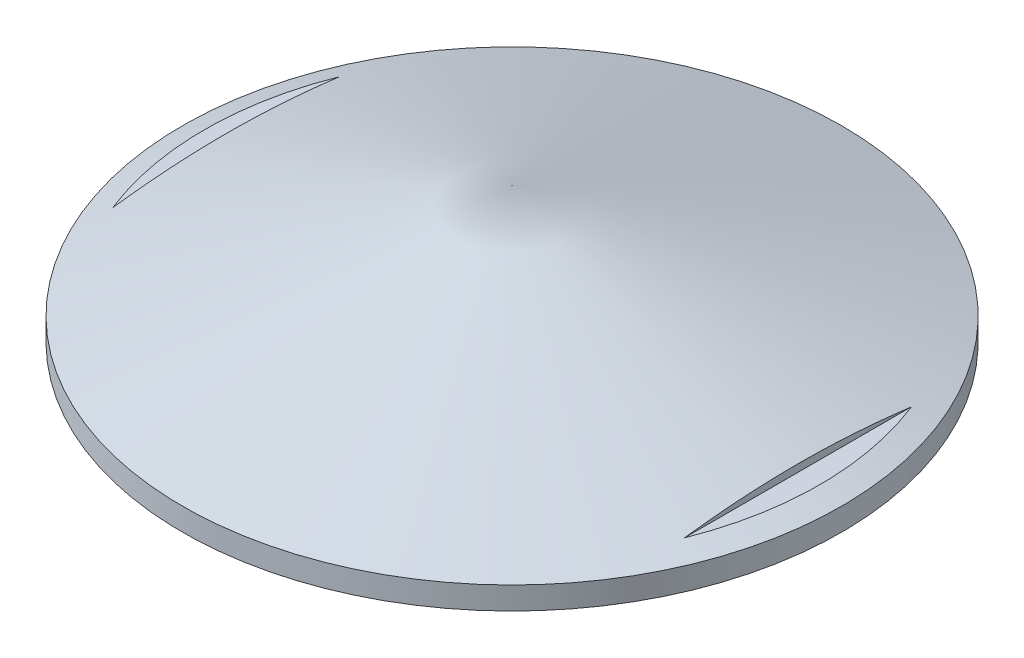
ISO-10303-21;
HEADER;
FILE_DESCRIPTION(('STEP AP214'),'2;1');
FILE_NAME('part.step','',(''),(''),'','','');
FILE_SCHEMA(('AUTOMOTIVE_DESIGN { 1 0 10303 214 1 1 1 1 }'));
ENDSEC;
DATA;
#1=APPLICATION_CONTEXT('core data for automotive mechanical design processes');
#2=APPLICATION_PROTOCOL_DEFINITION('international standard','automotive_design',2000,#1);
#3=PRODUCT_CONTEXT('',#1,'mechanical');
#4=PRODUCT('Part','Part','',(#3));
#5=PRODUCT_RELATED_PRODUCT_CATEGORY('part','',(#4));
#6=PRODUCT_DEFINITION_FORMATION('','',#4);
#7=PRODUCT_DEFINITION_CONTEXT('part definition',#1,'design');
#8=PRODUCT_DEFINITION('design','',#6,#7);
#9=PRODUCT_DEFINITION_SHAPE('','',#8);
#10=(LENGTH_UNIT() NAMED_UNIT(*) SI_UNIT(.MILLI.,.METRE.));
#11=(NAMED_UNIT(*) PLANE_ANGLE_UNIT() SI_UNIT($,.RADIAN.));
#12=(NAMED_UNIT(*) SI_UNIT($,.STERADIAN.) SOLID_ANGLE_UNIT());
#13=UNCERTAINTY_MEASURE_WITH_UNIT(LENGTH_MEASURE(1.E-05),#10,'distance_accuracy_value','');
#14=(GEOMETRIC_REPRESENTATION_CONTEXT(3) GLOBAL_UNCERTAINTY_ASSIGNED_CONTEXT((#13)) GLOBAL_UNIT_ASSIGNED_CONTEXT((#10,
#11,#12)) REPRESENTATION_CONTEXT('',''));
#15=CARTESIAN_POINT('',(0.,0.,0.));
#16=DIRECTION('',(0.,0.,1.));
#17=DIRECTION('',(1.,0.,0.));
#18=AXIS2_PLACEMENT_3D('',#15,#16,#17);
#19=CARTESIAN_POINT('',(0.,77000.,0.));
#20=DIRECTION('',(0.,-1.,0.));
#21=DIRECTION('',(0.,0.,-1.));
#22=AXIS2_PLACEMENT_3D('',#19,#20,#21);
#23=CONICAL_SURFACE('',#22,4380.,1.24084923464834);
#24=CARTESIAN_POINT('',(3800.,75998.5531824134,-6237.92422008342));
#25=CARTESIAN_POINT('',(3800.,76009.8379453092,-6199.3399568764));
#26=CARTESIAN_POINT('',(3800.,76021.096645658,-6160.74806725259));
#27=CARTESIAN_POINT('',(3800.,76043.5595675973,-6083.54842607459));
#28=CARTESIAN_POINT('',(3800.,76054.7637891738,-6044.94067451633));
#29=CARTESIAN_POINT('',(3800.,76077.1154216929,-5967.70862486792));
#30=CARTESIAN_POINT('',(3800.,76088.2628324952,-5929.08432673716));
#31=CARTESIAN_POINT('',(3800.,76110.4982964015,-5851.81865002385));
#32=CARTESIAN_POINT('',(3800.,76121.5863495094,-5813.17727144242));
#33=CARTESIAN_POINT('',(3800.,76143.7007864115,-5735.87560534131));
#34=CARTESIAN_POINT('',(3800.,76154.7271683296,-5697.21531728493));
#35=CARTESIAN_POINT('',(3800.,76176.7151290232,-5619.87631767362));
#36=CARTESIAN_POINT('',(3800.,76187.6767078019,-5581.19760611963));
#37=CARTESIAN_POINT('',(3800.,76209.5321084246,-5503.82106416189));
#38=CARTESIAN_POINT('',(3800.,76220.4259303032,-5465.12323376791));
#39=CARTESIAN_POINT('',(3800.,76242.1427099793,-5387.70769210286));
#40=CARTESIAN_POINT('',(3800.,76252.965667777,-5348.98998083187));
#41=CARTESIAN_POINT('',(3800.,76274.5422806465,-5271.51649838714));
#42=CARTESIAN_POINT('',(3800.,76285.2959023837,-5232.76071792854));
#43=CARTESIAN_POINT('',(3800.,76306.7254533265,-5155.22768077519));
#44=CARTESIAN_POINT('',(3800.,76317.401382532,-5116.45042408039));
#45=CARTESIAN_POINT('',(3800.,76338.6718801168,-5038.87358908234));
#46=CARTESIAN_POINT('',(3800.,76349.2664484752,-5000.0740107733));
#47=CARTESIAN_POINT('',(3800.,76370.370343294,-4922.45167550836));
#48=CARTESIAN_POINT('',(3800.,76380.8796697543,-4883.62891855243));
#49=CARTESIAN_POINT('',(3800.,76401.8089285316,-4805.95952935996));
#50=CARTESIAN_POINT('',(3800.,76412.2288613135,-4767.11289724875));
#51=CARTESIAN_POINT('',(3800.,76432.9750581734,-4689.39462534744));
#52=CARTESIAN_POINT('',(3800.,76443.3013222515,-4650.5229855574));
#53=CARTESIAN_POINT('',(3800.,76463.8556084062,-4572.75372812389));
#54=CARTESIAN_POINT('',(3800.,76474.0836304629,-4533.85611047515));
#55=CARTESIAN_POINT('',(3800.,76494.4365956534,-4456.03391173875));
#56=CARTESIAN_POINT('',(3800.,76504.5615387858,-4417.10933065069));
#57=CARTESIAN_POINT('',(3800.,76524.8369232714,-4338.71529344639));
#58=CARTESIAN_POINT('',(3800.,76534.9859189713,-4299.24546335723));
#59=CARTESIAN_POINT('',(3800.,76555.1672161394,-4220.27597476962));
#60=CARTESIAN_POINT('',(3800.,76565.1995176063,-4180.77631627086));
#61=CARTESIAN_POINT('',(3800.,76585.1414932928,-4101.74603549405));
#62=CARTESIAN_POINT('',(3800.,76595.0511674709,-4062.21541320555));
#63=CARTESIAN_POINT('',(3800.,76614.7416129558,-3983.1220707259));
#64=CARTESIAN_POINT('',(3800.,76624.5223842626,-3943.55935053477));
#65=CARTESIAN_POINT('',(3800.,76643.9484728147,-3864.40034488816));
#66=CARTESIAN_POINT('',(3800.,76653.5937890397,-3824.80405918221));
#67=CARTESIAN_POINT('',(3800.,76672.7418996756,-3745.57703308251));
#68=CARTESIAN_POINT('',(3800.,76682.2446940861,-3705.94629268865));
#69=CARTESIAN_POINT('',(3800.,76701.100388001,-3626.64914477663));
#70=CARTESIAN_POINT('',(3800.,76710.4532874539,-3586.9827372462));
#71=CARTESIAN_POINT('',(3800.,76729.0014132941,-3507.61306412802));
#72=CARTESIAN_POINT('',(3800.,76738.1966396813,-3467.90979854022));
#73=CARTESIAN_POINT('',(3800.,76756.4223884495,-3388.46016745048));
#74=CARTESIAN_POINT('',(3800.,76765.4528897867,-3348.71379711954));
#75=CARTESIAN_POINT('',(3800.,76783.3393757559,-3269.18179465581));
#76=CARTESIAN_POINT('',(3800.,76792.1953603867,-3229.39616252277));
#77=CARTESIAN_POINT('',(3800.,76809.7237713471,-3149.78443270682));
#78=CARTESIAN_POINT('',(3800.,76818.3961975174,-3109.95833498884));
#79=CARTESIAN_POINT('',(3800.,76835.5479925197,-3030.26457392473));
#80=CARTESIAN_POINT('',(3800.,76844.0273613542,-2990.39691057909));
#81=CARTESIAN_POINT('',(3800.,76860.7831306196,-2910.61880946304));
#82=CARTESIAN_POINT('',(3800.,76869.0595304293,-2870.70837156208));
#83=CARTESIAN_POINT('',(3800.,76885.3989528552,-2790.84381941902));
#84=CARTESIAN_POINT('',(3800.,76893.4619754598,-2750.88970517452));
#85=CARTESIAN_POINT('',(3800.,76909.3638195322,-2670.93686807738));
#86=CARTESIAN_POINT('',(3800.,76917.2026410176,-2630.93814522823));
#87=CARTESIAN_POINT('',(3800.,76932.6448313087,-2550.89525847114));
#88=CARTESIAN_POINT('',(3800.,76940.2482001609,-2510.85109457218));
#89=CARTESIAN_POINT('',(3800.,76954.9054796204,-2432.33617923342));
#90=CARTESIAN_POINT('',(3800.,76961.9691770541,-2393.8672554886));
#91=CARTESIAN_POINT('',(3800.,76975.8583901794,-2316.88642393146));
#92=CARTESIAN_POINT('',(3800.,76982.6839059006,-2278.3745161245));
#93=CARTESIAN_POINT('',(3800.,76996.0858338478,-2201.30730279405));
#94=CARTESIAN_POINT('',(3800.,77002.6622459414,-2162.7519972475));
#95=CARTESIAN_POINT('',(3800.,77015.5547424166,-2085.59798627629));
#96=CARTESIAN_POINT('',(3800.,77021.8708267903,-2046.9992808503));
#97=CARTESIAN_POINT('',(3800.,77040.4116272516,-1931.13722435574));
#98=CARTESIAN_POINT('',(3800.,77052.2288937054,-1853.80791573044));
#99=CARTESIAN_POINT('',(3800.,77069.06988517,-1737.68626804699));
#100=CARTESIAN_POINT('',(3800.,77074.5360891182,-1698.95757963295));
#101=CARTESIAN_POINT('',(3800.,77085.1618591099,-1621.45820317515));
#102=CARTESIAN_POINT('',(3800.,77090.3214265071,-1582.68751531754));
#103=CARTESIAN_POINT('',(3800.,77100.3200834665,-1505.12245912467));
#104=CARTESIAN_POINT('',(3800.,77105.1593153109,-1466.32810913229));
#105=CARTESIAN_POINT('',(3800.,77114.5083884467,-1388.69970118353));
#106=CARTESIAN_POINT('',(3800.,77119.0182297427,-1349.8656432277));
#107=CARTESIAN_POINT('',(3800.,77127.6973510706,-1272.15942766962));
#108=CARTESIAN_POINT('',(3800.,77131.8666308234,-1233.28727003617));
#109=CARTESIAN_POINT('',(3800.,77139.8538279322,-1155.50684275481));
#110=CARTESIAN_POINT('',(3800.,77143.6717452948,-1116.59857310758));
#111=CARTESIAN_POINT('',(3800.,77150.9458702418,-1038.74867732611));
#112=CARTESIAN_POINT('',(3800.,77154.4020821649,-999.807051597634));
#113=CARTESIAN_POINT('',(3800.,77160.9431599725,-921.892595754104));
#114=CARTESIAN_POINT('',(3800.,77164.0280258562,-882.919765638991));
#115=CARTESIAN_POINT('',(3800.,77169.8174607676,-804.94583542144));
#116=CARTESIAN_POINT('',(3800.,77172.5220297292,-765.944735314081));
#117=CARTESIAN_POINT('',(3800.,77177.5427761848,-687.917521483922));
#118=CARTESIAN_POINT('',(3800.,77179.8589537131,-648.891407763322));
#119=CARTESIAN_POINT('',(3800.,77184.0826069774,-571.060762278611));
#120=CARTESIAN_POINT('',(3800.,77185.9925377002,-532.256363850791));
#121=CARTESIAN_POINT('',(3800.,77189.4158655688,-454.630064049266));
#122=CARTESIAN_POINT('',(3800.,77190.929262744,-415.808162676855));
#123=CARTESIAN_POINT('',(3800.,77193.5547341105,-338.150772314381));
#124=CARTESIAN_POINT('',(3800.,77194.6668082419,-299.31528332229));
#125=CARTESIAN_POINT('',(3800.,77196.48606296,-221.634812594317));
#126=CARTESIAN_POINT('',(3800.,77197.1932435436,-182.78983085836));
#127=CARTESIAN_POINT('',(3800.,77198.2004194082,-105.094471501238));
#128=CARTESIAN_POINT('',(3800.,77198.5004135159,-66.2440938648478));
#129=CARTESIAN_POINT('',(3800.,77198.6922344373,11.4576700113805));
#130=CARTESIAN_POINT('',(3800.,77198.584061252,50.3090562512157));
#131=CARTESIAN_POINT('',(3800.,77197.959900862,128.008526869545));
#132=CARTESIAN_POINT('',(3800.,77197.443913893,166.856611249935));
#133=CARTESIAN_POINT('',(3800.,77196.0058047322,244.545253956876));
#134=CARTESIAN_POINT('',(3800.,77195.0836825416,283.385812283449));
#135=CARTESIAN_POINT('',(3800.,77192.8360496856,361.063174682239));
#136=CARTESIAN_POINT('',(3800.,77191.5104567567,399.899976371675));
#137=CARTESIAN_POINT('',(3800.,77188.4601746439,477.557890140778));
#138=CARTESIAN_POINT('',(3800.,77186.7354854359,516.379002219497));
#139=CARTESIAN_POINT('',(3800.,77182.8924165024,594.00179548118));
#140=CARTESIAN_POINT('',(3800.,77180.7740359668,632.803476623995));
#141=CARTESIAN_POINT('',(3800.,77176.1500945859,710.383733123328));
#142=CARTESIAN_POINT('',(3800.,77173.6445338021,749.162308483507));
#143=CARTESIAN_POINT('',(3800.,77168.2537677402,826.692620410002));
#144=CARTESIAN_POINT('',(3800.,77165.3685665277,865.444357259261));
#145=CARTESIAN_POINT('',(3800.,77159.2268966605,942.918394968449));
#146=CARTESIAN_POINT('',(3800.,77155.970427759,981.640695808788));
#147=CARTESIAN_POINT('',(3800.,77149.0954258663,1059.05279965476));
#148=CARTESIAN_POINT('',(3800.,77145.4768958803,1097.74260292744));
#149=CARTESIAN_POINT('',(3800.,77137.8876038877,1175.08748583197));
#150=CARTESIAN_POINT('',(3800.,77133.9168427303,1213.74256554731));
#151=CARTESIAN_POINT('',(3800.,77124.1821785211,1304.55434214812));
#152=CARTESIAN_POINT('',(3800.,77118.277484648,1356.69599186548));
#153=CARTESIAN_POINT('',(3800.,77105.8714273676,1460.90759153261));
#154=CARTESIAN_POINT('',(3800.,77099.3700694348,1512.9775421358));
#155=CARTESIAN_POINT('',(3800.,77085.7986050285,1617.04087565732));
#156=CARTESIAN_POINT('',(3800.,77078.7285234485,1669.03426182563));
#157=CARTESIAN_POINT('',(3800.,77064.0474773758,1772.94464391576));
#158=CARTESIAN_POINT('',(3800.,77056.4365115398,1824.86163964756));
#159=CARTESIAN_POINT('',(3800.,77040.7030936123,1928.60998159794));
#160=CARTESIAN_POINT('',(3800.,77032.5807187186,1980.44133953722));
#161=CARTESIAN_POINT('',(3800.,77015.8513673045,2084.02566920287));
#162=CARTESIAN_POINT('',(3800.,77007.2443910955,2135.77864097963));
#163=CARTESIAN_POINT('',(3800.,76989.5730986079,2239.20690108864));
#164=CARTESIAN_POINT('',(3800.,76980.5087777311,2290.8821886345));
#165=CARTESIAN_POINT('',(3800.,76961.9494518925,2394.15530191537));
#166=CARTESIAN_POINT('',(3800.,76952.4544468458,2445.75312763509));
#167=CARTESIAN_POINT('',(3800.,76933.0187746904,2549.08844182159));
#168=CARTESIAN_POINT('',(3800.,76923.0764078331,2600.82561032201));
#169=CARTESIAN_POINT('',(3800.,76902.8080879463,2704.22469423818));
#170=CARTESIAN_POINT('',(3800.,76892.482134923,2755.88660965514));
#171=CARTESIAN_POINT('',(3800.,76871.4703817669,2859.13690396585));
#172=CARTESIAN_POINT('',(3800.,76860.7845833217,2910.72528320326));
#173=CARTESIAN_POINT('',(3800.,76839.0755594286,3013.83094719991));
#174=CARTESIAN_POINT('',(3800.,76828.0523339811,3065.34823195921));
#175=CARTESIAN_POINT('',(3800.,76805.6895919218,3168.31447855986));
#176=CARTESIAN_POINT('',(3800.,76794.3500728814,3219.76343987344));
#177=CARTESIAN_POINT('',(3800.,76771.3748058483,3322.5951376552));
#178=CARTESIAN_POINT('',(3800.,76759.7390578624,3373.97787412494));
#179=CARTESIAN_POINT('',(3800.,76736.1900974327,3476.67967458092));
#180=CARTESIAN_POINT('',(3800.,76724.2768850812,3527.99873858833));
#181=CARTESIAN_POINT('',(3800.,76700.1905661495,3630.57581180363));
#182=CARTESIAN_POINT('',(3800.,76688.0174595578,3681.8338210088));
#183=CARTESIAN_POINT('',(3800.,76663.0598664356,3785.82440582392));
#184=CARTESIAN_POINT('',(3800.,76650.2679854372,3838.55520611562));
#185=CARTESIAN_POINT('',(3800.,76624.4427263029,3943.957613651));
#186=CARTESIAN_POINT('',(3800.,76611.4093481453,3996.62922088936));
#187=CARTESIAN_POINT('',(3800.,76585.1166839035,4101.91597235601));
#188=CARTESIAN_POINT('',(3800.,76571.8573979256,4154.53111661085));
#189=CARTESIAN_POINT('',(3800.,76545.127401084,4259.7076511379));
#190=CARTESIAN_POINT('',(3800.,76531.6566902273,4312.2690414119));
#191=CARTESIAN_POINT('',(3800.,76504.517208593,4417.34104046797));
#192=CARTESIAN_POINT('',(3800.,76490.848436426,4469.85164889105));
#193=CARTESIAN_POINT('',(3800.,76463.3254252007,4574.82422301698));
#194=CARTESIAN_POINT('',(3800.,76449.4711861417,4627.28618871963));
#195=CARTESIAN_POINT('',(3800.,76421.5888603042,4732.16383369966));
#196=CARTESIAN_POINT('',(3800.,76407.5607736957,4784.57951302229));
#197=CARTESIAN_POINT('',(3800.,76379.3415130553,4889.3669401877));
#198=CARTESIAN_POINT('',(3800.,76365.1503390255,4941.73868803108));
#199=CARTESIAN_POINT('',(3800.,76336.7178384454,5046.06276605679));
#200=CARTESIAN_POINT('',(3800.,76322.4776123548,5098.01539623322));
#201=CARTESIAN_POINT('',(3800.,76293.8553621982,5201.88157319803));
#202=CARTESIAN_POINT('',(3800.,76279.4733381322,5253.79511998641));
#203=CARTESIAN_POINT('',(3800.,76250.5759170146,5357.58515107518));
#204=CARTESIAN_POINT('',(3800.,76236.0605197747,5409.46163532317));
#205=CARTESIAN_POINT('',(3800.,76206.9042228522,5513.17931459817));
#206=CARTESIAN_POINT('',(3800.,76192.263323175,5565.02050962669));
#207=CARTESIAN_POINT('',(3800.,76162.8647048337,5668.66448544183));
#208=CARTESIAN_POINT('',(3800.,76148.1069973005,5720.46726938624));
#209=CARTESIAN_POINT('',(3800.,76118.4801878135,5824.04097672846));
#210=CARTESIAN_POINT('',(3800.,76103.6110858413,5875.81190012096));
#211=CARTESIAN_POINT('',(3800.,76073.7679124257,5979.32309910432));
#212=CARTESIAN_POINT('',(3800.,76058.7938417008,6031.06337490235));
#213=CARTESIAN_POINT('',(3800.,76036.2583493342,6108.65215581594));
#214=CARTESIAN_POINT('',(3800.,76028.7341227846,6134.51147064854));
#215=CARTESIAN_POINT('',(3800.,76013.66156169,6186.22307156504));
#216=CARTESIAN_POINT('',(3800.,76006.1132271467,6212.07535764945));
#217=CARTESIAN_POINT('',(3800.,75998.5531824134,6237.92422008342));
#218=B_SPLINE_CURVE_WITH_KNOTS('',3,(#24,#25,#26,#27,#28,#29,#30,#31,#32,#33,#34,#35,#36,#37,
#38,#39,#40,#41,#42,#43,#44,#45,#46,#47,#48,#49,#50,#51,#52,#53,#54,#55,#56,#57,#58,#59,#60,#61,
#62,#63,#64,#65,#66,#67,#68,#69,#70,#71,#72,#73,#74,#75,#76,#77,#78,#79,#80,#81,#82,#83,#84,#85,
#86,#87,#88,#89,#90,#91,#92,#93,#94,#95,#96,#97,#98,#99,#100,#101,#102,#103,#104,#105,#106,#107,
#108,#109,#110,#111,#112,#113,#114,#115,#116,#117,#118,#119,#120,#121,#122,#123,#124,#125,#126,
#127,#128,#129,#130,#131,#132,#133,#134,#135,#136,#137,#138,#139,#140,#141,#142,#143,#144,#145,
#146,#147,#148,#149,#150,#151,#152,#153,#154,#155,#156,#157,#158,#159,#160,#161,#162,#163,#164,
#165,#166,#167,#168,#169,#170,#171,#172,#173,#174,#175,#176,#177,#178,#179,#180,#181,#182,#183,
#184,#185,#186,#187,#188,#189,#190,#191,#192,#193,#194,#195,#196,#197,#198,#199,#200,#201,#202,
#203,#204,#205,#206,#207,#208,#209,#210,#211,#212,#213,#214,#215,#216,#217),.UNSPECIFIED.,.F.,
.F.,(4,2,2,2,2,2,2,2,2,2,2,2,2,2,2,2,2,2,2,2,2,2,2,2,2,2,2,2,2,2,2,2,2,2,2,2,2,2,2,2,2,2,2,2,2,
2,2,2,2,2,2,2,2,2,2,2,2,2,2,2,2,2,2,2,2,2,2,2,2,2,2,2,2,2,2,2,2,2,2,2,2,2,2,2,2,2,2,2,2,2,2,2,2,
2,2,2,4),(0.,120.601908289968,241.20384751981,361.806084386147,482.408313298167,
603.014190870593,723.620062253477,844.225872043048,964.831681400564,1085.4916974586,
1206.15171371327,1326.81176118971,1447.4718088387,1568.1312284245,1688.79064769758,
1809.45009141542,1930.10953689286,2052.37067092371,2174.63180620945,2296.89298276412,
2419.15415923573,2541.41625620127,2663.67835351377,2785.94049291153,2908.20263246787,
3030.48028328641,3152.75793488564,3275.03569254665,3397.3134487264,3519.59157913824,
3641.86971627989,3764.14784387363,3886.42594732079,4003.7614363159,4121.09691066226,
4238.43244735424,4355.76798762939,4590.43901537741,4707.77568910926,4825.11184484042,
4942.39552920964,5059.67921194568,5176.96299079442,5294.24676737809,5411.52913697842,
5528.81150681187,5646.09389706082,5763.37627699283,5879.92839767817,5996.48050974417,
6113.03263921075,6229.58476959923,6346.13723583988,6462.68970179753,6579.24210040428,
6695.79449867602,6812.37067674572,6928.9468618483,7045.52328684052,7162.09969335905,
7278.67485157519,7395.25008730099,7511.82435547806,7628.39834259703,7785.81931389167,
7943.2388409385,8100.65148129769,8258.06451257043,8415.45383886223,8572.84306398097,
8730.23387178588,8887.62471065582,9045.67463882499,9203.72456448303,9361.77374909727,
9519.82293354809,9677.87333182693,9835.92372642484,9993.97406850511,10152.024417614,
10314.8044117491,10477.5844205223,10640.3643527068,10803.1442794793,10965.9253486757,
11128.7064185346,11291.4873291156,11454.2682375255,11615.8747645441,11777.4812915456,
11939.0880466357,12100.6947948089,12262.2863241792,12423.877880456,12585.468331658,
12666.2635155327,12747.0586935834),.UNSPECIFIED.);
#219=CARTESIAN_POINT('',(3800.,77100.,-1507.23057293837));
#220=VERTEX_POINT('',#219);
#221=CARTESIAN_POINT('',(3800.,77100.,1507.23057293837));
#222=VERTEX_POINT('',#221);
#223=EDGE_CURVE('E11',#220,#222,#218,.T.);
#224=ORIENTED_EDGE('',*,*,#223,.F.);
#225=CARTESIAN_POINT('',(0.,77100.,0.));
#226=DIRECTION('',(0.,-1.,0.));
#227=DIRECTION('',(0.,0.,-1.));
#228=AXIS2_PLACEMENT_3D('',#225,#226,#227);
#229=CIRCLE('',#228,4088.00000000002);
#230=EDGE_CURVE('E55',#222,#220,#229,.F.);
#231=ORIENTED_EDGE('',*,*,#230,.F.);
#232=EDGE_LOOP('',(#224,#231));
#233=FACE_BOUND('',#232,.T.);
#234=CARTESIAN_POINT('',(-3800.,75998.5531824134,6237.92422008342));
#235=CARTESIAN_POINT('',(-3800.,76009.8379453092,6199.3399568764));
#236=CARTESIAN_POINT('',(-3800.,76021.096645658,6160.74806725259));
#237=CARTESIAN_POINT('',(-3800.,76043.5595675973,6083.54842607459));
#238=CARTESIAN_POINT('',(-3800.,76054.7637891738,6044.94067451633));
#239=CARTESIAN_POINT('',(-3800.,76077.1154216929,5967.70862486792));
#240=CARTESIAN_POINT('',(-3800.,76088.2628324952,5929.08432673716));
#241=CARTESIAN_POINT('',(-3800.,76110.4982964015,5851.81865002385));
#242=CARTESIAN_POINT('',(-3800.,76121.5863495094,5813.17727144242));
#243=CARTESIAN_POINT('',(-3800.,76143.7007864115,5735.87560534131));
#244=CARTESIAN_POINT('',(-3800.,76154.7271683296,5697.21531728493));
#245=CARTESIAN_POINT('',(-3800.,76176.7151290232,5619.87631767362));
#246=CARTESIAN_POINT('',(-3800.,76187.6767078019,5581.19760611963));
#247=CARTESIAN_POINT('',(-3800.,76209.5321084246,5503.82106416189));
#248=CARTESIAN_POINT('',(-3800.,76220.4259303032,5465.12323376791));
#249=CARTESIAN_POINT('',(-3800.,76242.1427099793,5387.70769210286));
#250=CARTESIAN_POINT('',(-3800.,76252.965667777,5348.98998083187));
#251=CARTESIAN_POINT('',(-3800.,76274.5422806465,5271.51649838714));
#252=CARTESIAN_POINT('',(-3800.,76285.2959023837,5232.76071792854));
#253=CARTESIAN_POINT('',(-3800.,76306.7254533265,5155.22768077519));
#254=CARTESIAN_POINT('',(-3800.,76317.401382532,5116.45042408039));
#255=CARTESIAN_POINT('',(-3800.,76338.6718801168,5038.87358908234));
#256=CARTESIAN_POINT('',(-3800.,76349.2664484752,5000.0740107733));
#257=CARTESIAN_POINT('',(-3800.,76370.370343294,4922.45167550836));
#258=CARTESIAN_POINT('',(-3800.,76380.8796697543,4883.62891855243));
#259=CARTESIAN_POINT('',(-3800.,76401.8089285316,4805.95952935996));
#260=CARTESIAN_POINT('',(-3800.,76412.2288613135,4767.11289724875));
#261=CARTESIAN_POINT('',(-3800.,76432.9750581734,4689.39462534744));
#262=CARTESIAN_POINT('',(-3800.,76443.3013222515,4650.5229855574));
#263=CARTESIAN_POINT('',(-3800.,76463.8556084062,4572.75372812389));
#264=CARTESIAN_POINT('',(-3800.,76474.0836304629,4533.85611047515));
#265=CARTESIAN_POINT('',(-3800.,76494.4365956534,4456.03391173875));
#266=CARTESIAN_POINT('',(-3800.,76504.5615387858,4417.10933065069));
#267=CARTESIAN_POINT('',(-3800.,76524.8369232714,4338.71529344639));
#268=CARTESIAN_POINT('',(-3800.,76534.9859189713,4299.24546335723));
#269=CARTESIAN_POINT('',(-3800.,76555.1672161394,4220.27597476962));
#270=CARTESIAN_POINT('',(-3800.,76565.1995176063,4180.77631627086));
#271=CARTESIAN_POINT('',(-3800.,76585.1414932928,4101.74603549405));
#272=CARTESIAN_POINT('',(-3800.,76595.0511674709,4062.21541320555));
#273=CARTESIAN_POINT('',(-3800.,76614.7416129558,3983.1220707259));
#274=CARTESIAN_POINT('',(-3800.,76624.5223842626,3943.55935053477));
#275=CARTESIAN_POINT('',(-3800.,76643.9484728147,3864.40034488816));
#276=CARTESIAN_POINT('',(-3800.,76653.5937890397,3824.80405918221));
#277=CARTESIAN_POINT('',(-3800.,76672.7418996756,3745.57703308251));
#278=CARTESIAN_POINT('',(-3800.,76682.2446940861,3705.94629268865));
#279=CARTESIAN_POINT('',(-3800.,76701.100388001,3626.64914477663));
#280=CARTESIAN_POINT('',(-3800.,76710.4532874539,3586.9827372462));
#281=CARTESIAN_POINT('',(-3800.,76729.0014132941,3507.61306412802));
#282=CARTESIAN_POINT('',(-3800.,76738.1966396813,3467.90979854022));
#283=CARTESIAN_POINT('',(-3800.,76756.4223884495,3388.46016745048));
#284=CARTESIAN_POINT('',(-3800.,76765.4528897867,3348.71379711954));
#285=CARTESIAN_POINT('',(-3800.,76783.3393757559,3269.18179465581));
#286=CARTESIAN_POINT('',(-3800.,76792.1953603867,3229.39616252277));
#287=CARTESIAN_POINT('',(-3800.,76809.7237713471,3149.78443270682));
#288=CARTESIAN_POINT('',(-3800.,76818.3961975174,3109.95833498884));
#289=CARTESIAN_POINT('',(-3800.,76835.5479925197,3030.26457392473));
#290=CARTESIAN_POINT('',(-3800.,76844.0273613542,2990.39691057909));
#291=CARTESIAN_POINT('',(-3800.,76860.7831306196,2910.61880946304));
#292=CARTESIAN_POINT('',(-3800.,76869.0595304293,2870.70837156208));
#293=CARTESIAN_POINT('',(-3800.,76885.3989528552,2790.84381941902));
#294=CARTESIAN_POINT('',(-3800.,76893.4619754598,2750.88970517452));
#295=CARTESIAN_POINT('',(-3800.,76909.3638195322,2670.93686807738));
#296=CARTESIAN_POINT('',(-3800.,76917.2026410176,2630.93814522823));
#297=CARTESIAN_POINT('',(-3800.,76932.6448313087,2550.89525847114));
#298=CARTESIAN_POINT('',(-3800.,76940.2482001609,2510.85109457218));
#299=CARTESIAN_POINT('',(-3800.,76954.9054796204,2432.33617923342));
#300=CARTESIAN_POINT('',(-3800.,76961.9691770541,2393.8672554886));
#301=CARTESIAN_POINT('',(-3800.,76975.8583901794,2316.88642393146));
#302=CARTESIAN_POINT('',(-3800.,76982.6839059006,2278.3745161245));
#303=CARTESIAN_POINT('',(-3800.,76996.0858338478,2201.30730279405));
#304=CARTESIAN_POINT('',(-3800.,77002.6622459414,2162.7519972475));
#305=CARTESIAN_POINT('',(-3800.,77015.5547424166,2085.59798627629));
#306=CARTESIAN_POINT('',(-3800.,77021.8708267903,2046.9992808503));
#307=CARTESIAN_POINT('',(-3800.,77040.4116272516,1931.13722435574));
#308=CARTESIAN_POINT('',(-3800.,77052.2288937054,1853.80791573044));
#309=CARTESIAN_POINT('',(-3800.,77069.06988517,1737.68626804699));
#310=CARTESIAN_POINT('',(-3800.,77074.5360891182,1698.95757963295));
#311=CARTESIAN_POINT('',(-3800.,77085.1618591099,1621.45820317515));
#312=CARTESIAN_POINT('',(-3800.,77090.3214265071,1582.68751531754));
#313=CARTESIAN_POINT('',(-3800.,77100.3200834665,1505.12245912467));
#314=CARTESIAN_POINT('',(-3800.,77105.1593153109,1466.32810913229));
#315=CARTESIAN_POINT('',(-3800.,77114.5083884467,1388.69970118353));
#316=CARTESIAN_POINT('',(-3800.,77119.0182297427,1349.8656432277));
#317=CARTESIAN_POINT('',(-3800.,77127.6973510706,1272.15942766962));
#318=CARTESIAN_POINT('',(-3800.,77131.8666308234,1233.28727003617));
#319=CARTESIAN_POINT('',(-3800.,77139.8538279322,1155.50684275481));
#320=CARTESIAN_POINT('',(-3800.,77143.6717452948,1116.59857310758));
#321=CARTESIAN_POINT('',(-3800.,77150.9458702418,1038.74867732611));
#322=CARTESIAN_POINT('',(-3800.,77154.4020821649,999.807051597634));
#323=CARTESIAN_POINT('',(-3800.,77160.9431599725,921.892595754104));
#324=CARTESIAN_POINT('',(-3800.,77164.0280258562,882.919765638991));
#325=CARTESIAN_POINT('',(-3800.,77169.8174607676,804.94583542144));
#326=CARTESIAN_POINT('',(-3800.,77172.5220297292,765.944735314081));
#327=CARTESIAN_POINT('',(-3800.,77177.5427761848,687.917521483922));
#328=CARTESIAN_POINT('',(-3800.,77179.8589537131,648.891407763322));
#329=CARTESIAN_POINT('',(-3800.,77184.0826069774,571.060762278611));
#330=CARTESIAN_POINT('',(-3800.,77185.9925377002,532.256363850791));
#331=CARTESIAN_POINT('',(-3800.,77189.4158655688,454.630064049266));
#332=CARTESIAN_POINT('',(-3800.,77190.929262744,415.808162676855));
#333=CARTESIAN_POINT('',(-3800.,77193.5547341105,338.150772314381));
#334=CARTESIAN_POINT('',(-3800.,77194.6668082419,299.31528332229));
#335=CARTESIAN_POINT('',(-3800.,77196.48606296,221.634812594317));
#336=CARTESIAN_POINT('',(-3800.,77197.1932435436,182.78983085836));
#337=CARTESIAN_POINT('',(-3800.,77198.2004194082,105.094471501238));
#338=CARTESIAN_POINT('',(-3800.,77198.5004135159,66.2440938648478));
#339=CARTESIAN_POINT('',(-3800.,77198.6922344373,-11.4576700113805));
#340=CARTESIAN_POINT('',(-3800.,77198.584061252,-50.3090562512157));
#341=CARTESIAN_POINT('',(-3800.,77197.959900862,-128.008526869545));
#342=CARTESIAN_POINT('',(-3800.,77197.443913893,-166.856611249935));
#343=CARTESIAN_POINT('',(-3800.,77196.0058047322,-244.545253956876));
#344=CARTESIAN_POINT('',(-3800.,77195.0836825416,-283.385812283449));
#345=CARTESIAN_POINT('',(-3800.,77192.8360496856,-361.063174682239));
#346=CARTESIAN_POINT('',(-3800.,77191.5104567567,-399.899976371675));
#347=CARTESIAN_POINT('',(-3800.,77188.4601746439,-477.557890140778));
#348=CARTESIAN_POINT('',(-3800.,77186.7354854359,-516.379002219497));
#349=CARTESIAN_POINT('',(-3800.,77182.8924165024,-594.00179548118));
#350=CARTESIAN_POINT('',(-3800.,77180.7740359668,-632.803476623995));
#351=CARTESIAN_POINT('',(-3800.,77176.1500945859,-710.383733123328));
#352=CARTESIAN_POINT('',(-3800.,77173.6445338021,-749.162308483507));
#353=CARTESIAN_POINT('',(-3800.,77168.2537677402,-826.692620410002));
#354=CARTESIAN_POINT('',(-3800.,77165.3685665277,-865.444357259261));
#355=CARTESIAN_POINT('',(-3800.,77159.2268966605,-942.918394968449));
#356=CARTESIAN_POINT('',(-3800.,77155.970427759,-981.640695808788));
#357=CARTESIAN_POINT('',(-3800.,77149.0954258663,-1059.05279965476));
#358=CARTESIAN_POINT('',(-3800.,77145.4768958803,-1097.74260292744));
#359=CARTESIAN_POINT('',(-3800.,77137.8876038877,-1175.08748583197));
#360=CARTESIAN_POINT('',(-3800.,77133.9168427303,-1213.74256554731));
#361=CARTESIAN_POINT('',(-3800.,77124.1821785211,-1304.55434214812));
#362=CARTESIAN_POINT('',(-3800.,77118.277484648,-1356.69599186548));
#363=CARTESIAN_POINT('',(-3800.,77105.8714273676,-1460.90759153261));
#364=CARTESIAN_POINT('',(-3800.,77099.3700694348,-1512.9775421358));
#365=CARTESIAN_POINT('',(-3800.,77085.7986050285,-1617.04087565732));
#366=CARTESIAN_POINT('',(-3800.,77078.7285234485,-1669.03426182563));
#367=CARTESIAN_POINT('',(-3800.,77064.0474773758,-1772.94464391576));
#368=CARTESIAN_POINT('',(-3800.,77056.4365115398,-1824.86163964756));
#369=CARTESIAN_POINT('',(-3800.,77040.7030936123,-1928.60998159794));
#370=CARTESIAN_POINT('',(-3800.,77032.5807187186,-1980.44133953722));
#371=CARTESIAN_POINT('',(-3800.,77015.8513673045,-2084.02566920287));
#372=CARTESIAN_POINT('',(-3800.,77007.2443910955,-2135.77864097963));
#373=CARTESIAN_POINT('',(-3800.,76989.5730986079,-2239.20690108864));
#374=CARTESIAN_POINT('',(-3800.,76980.5087777311,-2290.8821886345));
#375=CARTESIAN_POINT('',(-3800.,76961.9494518925,-2394.15530191537));
#376=CARTESIAN_POINT('',(-3800.,76952.4544468458,-2445.75312763509));
#377=CARTESIAN_POINT('',(-3800.,76933.0187746904,-2549.08844182159));
#378=CARTESIAN_POINT('',(-3800.,76923.0764078331,-2600.82561032201));
#379=CARTESIAN_POINT('',(-3800.,76902.8080879463,-2704.22469423818));
#380=CARTESIAN_POINT('',(-3800.,76892.482134923,-2755.88660965514));
#381=CARTESIAN_POINT('',(-3800.,76871.4703817669,-2859.13690396585));
#382=CARTESIAN_POINT('',(-3800.,76860.7845833217,-2910.72528320326));
#383=CARTESIAN_POINT('',(-3800.,76839.0755594286,-3013.83094719991));
#384=CARTESIAN_POINT('',(-3800.,76828.0523339811,-3065.34823195921));
#385=CARTESIAN_POINT('',(-3800.,76805.6895919218,-3168.31447855986));
#386=CARTESIAN_POINT('',(-3800.,76794.3500728814,-3219.76343987344));
#387=CARTESIAN_POINT('',(-3800.,76771.3748058483,-3322.5951376552));
#388=CARTESIAN_POINT('',(-3800.,76759.7390578624,-3373.97787412494));
#389=CARTESIAN_POINT('',(-3800.,76736.1900974327,-3476.67967458092));
#390=CARTESIAN_POINT('',(-3800.,76724.2768850812,-3527.99873858833));
#391=CARTESIAN_POINT('',(-3800.,76700.1905661495,-3630.57581180363));
#392=CARTESIAN_POINT('',(-3800.,76688.0174595578,-3681.8338210088));
#393=CARTESIAN_POINT('',(-3800.,76663.0598664356,-3785.82440582392));
#394=CARTESIAN_POINT('',(-3800.,76650.2679854372,-3838.55520611562));
#395=CARTESIAN_POINT('',(-3800.,76624.4427263029,-3943.957613651));
#396=CARTESIAN_POINT('',(-3800.,76611.4093481453,-3996.62922088936));
#397=CARTESIAN_POINT('',(-3800.,76585.1166839035,-4101.91597235601));
#398=CARTESIAN_POINT('',(-3800.,76571.8573979256,-4154.53111661085));
#399=CARTESIAN_POINT('',(-3800.,76545.127401084,-4259.7076511379));
#400=CARTESIAN_POINT('',(-3800.,76531.6566902273,-4312.2690414119));
#401=CARTESIAN_POINT('',(-3800.,76504.517208593,-4417.34104046797));
#402=CARTESIAN_POINT('',(-3800.,76490.848436426,-4469.85164889105));
#403=CARTESIAN_POINT('',(-3800.,76463.3254252007,-4574.82422301698));
#404=CARTESIAN_POINT('',(-3800.,76449.4711861417,-4627.28618871963));
#405=CARTESIAN_POINT('',(-3800.,76421.5888603042,-4732.16383369966));
#406=CARTESIAN_POINT('',(-3800.,76407.5607736957,-4784.57951302229));
#407=CARTESIAN_POINT('',(-3800.,76379.3415130553,-4889.3669401877));
#408=CARTESIAN_POINT('',(-3800.,76365.1503390255,-4941.73868803108));
#409=CARTESIAN_POINT('',(-3800.,76336.7178384454,-5046.06276605679));
#410=CARTESIAN_POINT('',(-3800.,76322.4776123548,-5098.01539623322));
#411=CARTESIAN_POINT('',(-3800.,76293.8553621982,-5201.88157319803));
#412=CARTESIAN_POINT('',(-3800.,76279.4733381322,-5253.79511998641));
#413=CARTESIAN_POINT('',(-3800.,76250.5759170146,-5357.58515107518));
#414=CARTESIAN_POINT('',(-3800.,76236.0605197747,-5409.46163532317));
#415=CARTESIAN_POINT('',(-3800.,76206.9042228522,-5513.17931459817));
#416=CARTESIAN_POINT('',(-3800.,76192.263323175,-5565.02050962669));
#417=CARTESIAN_POINT('',(-3800.,76162.8647048337,-5668.66448544183));
#418=CARTESIAN_POINT('',(-3800.,76148.1069973005,-5720.46726938624));
#419=CARTESIAN_POINT('',(-3800.,76118.4801878135,-5824.04097672846));
#420=CARTESIAN_POINT('',(-3800.,76103.6110858413,-5875.81190012096));
#421=CARTESIAN_POINT('',(-3800.,76073.7679124257,-5979.32309910432));
#422=CARTESIAN_POINT('',(-3800.,76058.7938417008,-6031.06337490235));
#423=CARTESIAN_POINT('',(-3800.,76036.2583493342,-6108.65215581594));
#424=CARTESIAN_POINT('',(-3800.,76028.7341227846,-6134.51147064854));
#425=CARTESIAN_POINT('',(-3800.,76013.66156169,-6186.22307156504));
#426=CARTESIAN_POINT('',(-3800.,76006.1132271467,-6212.07535764945));
#427=CARTESIAN_POINT('',(-3800.,75998.5531824134,-6237.92422008342));
#428=B_SPLINE_CURVE_WITH_KNOTS('',3,(#234,#235,#236,#237,#238,#239,#240,#241,#242,#243,#244,
#245,#246,#247,#248,#249,#250,#251,#252,#253,#254,#255,#256,#257,#258,#259,#260,#261,#262,#263,
#264,#265,#266,#267,#268,#269,#270,#271,#272,#273,#274,#275,#276,#277,#278,#279,#280,#281,#282,
#283,#284,#285,#286,#287,#288,#289,#290,#291,#292,#293,#294,#295,#296,#297,#298,#299,#300,#301,
#302,#303,#304,#305,#306,#307,#308,#309,#310,#311,#312,#313,#314,#315,#316,#317,#318,#319,#320,
#321,#322,#323,#324,#325,#326,#327,#328,#329,#330,#331,#332,#333,#334,#335,#336,#337,#338,#339,
#340,#341,#342,#343,#344,#345,#346,#347,#348,#349,#350,#351,#352,#353,#354,#355,#356,#357,#358,
#359,#360,#361,#362,#363,#364,#365,#366,#367,#368,#369,#370,#371,#372,#373,#374,#375,#376,#377,
#378,#379,#380,#381,#382,#383,#384,#385,#386,#387,#388,#389,#390,#391,#392,#393,#394,#395,#396,
#397,#398,#399,#400,#401,#402,#403,#404,#405,#406,#407,#408,#409,#410,#411,#412,#413,#414,#415,
#416,#417,#418,#419,#420,#421,#422,#423,#424,#425,#426,#427),.UNSPECIFIED.,.F.,.F.,(4,2,2,2,2,2,
2,2,2,2,2,2,2,2,2,2,2,2,2,2,2,2,2,2,2,2,2,2,2,2,2,2,2,2,2,2,2,2,2,2,2,2,2,2,2,2,2,2,2,2,2,2,2,2,
2,2,2,2,2,2,2,2,2,2,2,2,2,2,2,2,2,2,2,2,2,2,2,2,2,2,2,2,2,2,2,2,2,2,2,2,2,2,2,2,2,2,4),(0.,
120.601908289968,241.20384751981,361.806084386147,482.408313298167,603.014190870593,
723.620062253477,844.225872043048,964.831681400564,1085.4916974586,1206.15171371327,
1326.81176118971,1447.4718088387,1568.1312284245,1688.79064769758,1809.45009141542,
1930.10953689286,2052.37067092371,2174.63180620945,2296.89298276412,2419.15415923573,
2541.41625620127,2663.67835351377,2785.94049291153,2908.20263246787,3030.48028328641,
3152.75793488564,3275.03569254665,3397.3134487264,3519.59157913824,3641.86971627989,
3764.14784387363,3886.42594732079,4003.7614363159,4121.09691066226,4238.43244735424,
4355.76798762939,4590.43901537741,4707.77568910926,4825.11184484042,4942.39552920964,
5059.67921194568,5176.96299079442,5294.24676737809,5411.52913697842,5528.81150681187,
5646.09389706082,5763.37627699283,5879.92839767817,5996.48050974417,6113.03263921075,
6229.58476959923,6346.13723583988,6462.68970179753,6579.24210040428,6695.79449867602,
6812.37067674572,6928.9468618483,7045.52328684052,7162.09969335905,7278.67485157519,
7395.25008730099,7511.82435547806,7628.39834259703,7785.81931389167,7943.2388409385,
8100.65148129769,8258.06451257043,8415.45383886223,8572.84306398097,8730.23387178588,
8887.62471065582,9045.67463882499,9203.72456448303,9361.77374909727,9519.82293354809,
9677.87333182693,9835.92372642484,9993.97406850511,10152.024417614,10314.8044117491,
10477.5844205223,10640.3643527068,10803.1442794793,10965.9253486757,11128.7064185346,
11291.4873291156,11454.2682375255,11615.8747645441,11777.4812915456,11939.0880466357,
12100.6947948089,12262.2863241792,12423.877880456,12585.468331658,12666.2635155327,
12747.0586935834),.UNSPECIFIED.);
#429=CARTESIAN_POINT('',(-3800.,77100.,1507.23057293837));
#430=VERTEX_POINT('',#429);
#431=CARTESIAN_POINT('',(-3800.,77100.,-1507.23057293837));
#432=VERTEX_POINT('',#431);
#433=EDGE_CURVE('E78',#430,#432,#428,.T.);
#434=ORIENTED_EDGE('',*,*,#433,.F.);
#435=CARTESIAN_POINT('',(0.,77100.,0.));
#436=DIRECTION('',(0.,-1.,0.));
#437=DIRECTION('',(0.,0.,-1.));
#438=AXIS2_PLACEMENT_3D('',#435,#436,#437);
#439=CIRCLE('',#438,4088.00000000002);
#440=EDGE_CURVE('E77',#432,#430,#439,.F.);
#441=ORIENTED_EDGE('',*,*,#440,.F.);
#442=EDGE_LOOP('',(#434,#441));
#443=FACE_BOUND('',#442,.T.);
#444=CARTESIAN_POINT('',(0.,78500.,0.));
#445=VERTEX_POINT('',#444);
#446=VERTEX_LOOP('',#445);
#447=FACE_BOUND('',#446,.T.);
#448=CARTESIAN_POINT('',(0.,77000.,0.));
#449=DIRECTION('',(0.,-1.,0.));
#450=DIRECTION('',(0.,0.,-1.));
#451=AXIS2_PLACEMENT_3D('',#448,#449,#450);
#452=CIRCLE('',#451,4380.);
#453=CARTESIAN_POINT('',(0.,77000.,-4380.));
#454=VERTEX_POINT('',#453);
#455=EDGE_CURVE('E82',#454,#454,#452,.T.);
#456=ORIENTED_EDGE('',*,*,#455,.F.);
#457=EDGE_LOOP('',(#456));
#458=FACE_BOUND('',#457,.T.);
#459=ADVANCED_FACE('F39',(#233,#443,#447,#458),#23,.T.);
#460=CARTESIAN_POINT('',(0.,76500.,0.));
#461=DIRECTION('',(0.,-1.,0.));
#462=DIRECTION('',(0.,0.,-1.));
#463=AXIS2_PLACEMENT_3D('',#460,#461,#462);
#464=CYLINDRICAL_SURFACE('',#463,4380.);
#465=ORIENTED_EDGE('',*,*,#455,.T.);
#466=EDGE_LOOP('',(#465));
#467=FACE_BOUND('',#466,.T.);
#468=CARTESIAN_POINT('',(0.,76700.,0.));
#469=DIRECTION('',(0.,-1.,0.));
#470=DIRECTION('',(0.,0.,-1.));
#471=AXIS2_PLACEMENT_3D('',#468,#469,#470);
#472=CIRCLE('',#471,4380.);
#473=CARTESIAN_POINT('',(0.,76700.,-4380.));
#474=VERTEX_POINT('',#473);
#475=EDGE_CURVE('E120',#474,#474,#472,.T.);
#476=ORIENTED_EDGE('',*,*,#475,.F.);
#477=EDGE_LOOP('',(#476));
#478=FACE_BOUND('',#477,.T.);
#479=ADVANCED_FACE('F102',(#467,#478),#464,.T.);
#480=CARTESIAN_POINT('',(0.,78200.,0.));
#481=DIRECTION('',(0.,-1.,0.));
#482=DIRECTION('',(0.,0.,-1.));
#483=AXIS2_PLACEMENT_3D('',#480,#481,#482);
#484=CONICAL_SURFACE('',#483,0.,1.24084923464834);
#485=ORIENTED_EDGE('',*,*,#475,.T.);
#486=EDGE_LOOP('',(#485));
#487=FACE_BOUND('',#486,.T.);
#488=CARTESIAN_POINT('',(0.,78200.,0.));
#489=VERTEX_POINT('',#488);
#490=VERTEX_LOOP('',#489);
#491=FACE_BOUND('',#490,.T.);
#492=ADVANCED_FACE('F100',(#487,#491),#484,.F.);
#493=CARTESIAN_POINT('',(-3800.,77100.,-2000.));
#494=DIRECTION('',(1.,0.,0.));
#495=DIRECTION('',(0.,0.,-1.));
#496=AXIS2_PLACEMENT_3D('',#493,#494,#495);
#497=PLANE('',#496);
#498=ORIENTED_EDGE('',*,*,#433,.T.);
#499=DIRECTION('',(0.,0.,1.));
#500=VECTOR('',#499,1.);
#501=CARTESIAN_POINT('',(-3800.,77100.,-2000.));
#502=LINE('',#501,#500);
#503=EDGE_CURVE('E61',#432,#430,#502,.T.);
#504=ORIENTED_EDGE('',*,*,#503,.T.);
#505=EDGE_LOOP('',(#498,#504));
#506=FACE_BOUND('',#505,.T.);
#507=ADVANCED_FACE('F81',(#506),#497,.F.);
#508=CARTESIAN_POINT('',(-4600.,77100.,-2000.));
#509=DIRECTION('',(0.,-1.,0.));
#510=DIRECTION('',(0.,0.,-1.));
#511=AXIS2_PLACEMENT_3D('',#508,#509,#510);
#512=PLANE('',#511);
#513=ORIENTED_EDGE('',*,*,#440,.T.);
#514=ORIENTED_EDGE('',*,*,#503,.F.);
#515=EDGE_LOOP('',(#513,#514));
#516=FACE_BOUND('',#515,.T.);
#517=ADVANCED_FACE('F80',(#516),#512,.F.);
#518=CARTESIAN_POINT('',(3800.,77100.,-2000.));
#519=DIRECTION('',(-1.,0.,0.));
#520=DIRECTION('',(0.,0.,1.));
#521=AXIS2_PLACEMENT_3D('',#518,#519,#520);
#522=PLANE('',#521);
#523=ORIENTED_EDGE('',*,*,#223,.T.);
#524=DIRECTION('',(0.,0.,1.));
#525=VECTOR('',#524,1.);
#526=CARTESIAN_POINT('',(3800.,77100.,-2000.));
#527=LINE('',#526,#525);
#528=EDGE_CURVE('E59',#220,#222,#527,.T.);
#529=ORIENTED_EDGE('',*,*,#528,.F.);
#530=EDGE_LOOP('',(#523,#529));
#531=FACE_BOUND('',#530,.T.);
#532=ADVANCED_FACE('F98',(#531),#522,.F.);
#533=CARTESIAN_POINT('',(4500.,77100.,-2000.));
#534=DIRECTION('',(0.,-1.,0.));
#535=DIRECTION('',(0.,0.,-1.));
#536=AXIS2_PLACEMENT_3D('',#533,#534,#535);
#537=PLANE('',#536);
#538=ORIENTED_EDGE('',*,*,#230,.T.);
#539=ORIENTED_EDGE('',*,*,#528,.T.);
#540=EDGE_LOOP('',(#538,#539));
#541=FACE_BOUND('',#540,.T.);
#542=ADVANCED_FACE('F126',(#541),#537,.F.);
#543=CLOSED_SHELL('',(#459,#479,#492,#507,#517,#532,#542));
#544=MANIFOLD_SOLID_BREP('B2',#543);
#545=ADVANCED_BREP_SHAPE_REPRESENTATION('',(#18,#544),#14);
#546=SHAPE_DEFINITION_REPRESENTATION(#9,#545);
ENDSEC;
END-ISO-10303-21;
